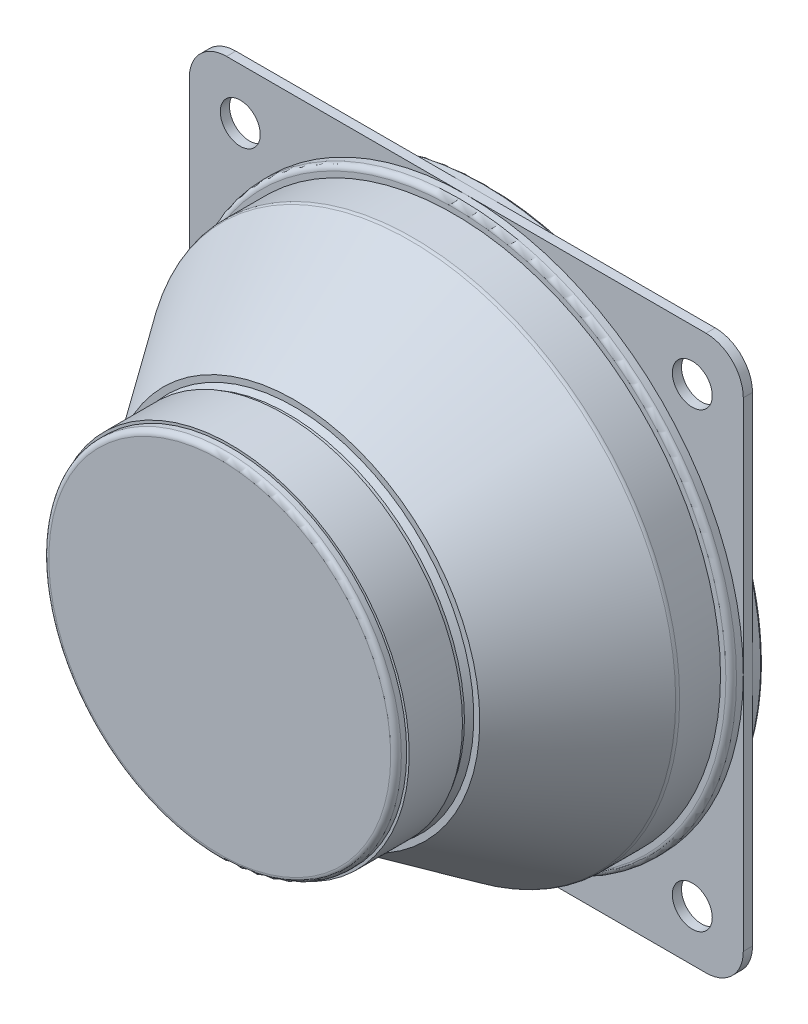
ISO-10303-21;
HEADER;
FILE_DESCRIPTION(('STEP AP214'),'2;1');
FILE_NAME('part.step','',(''),(''),'','','');
FILE_SCHEMA(('AUTOMOTIVE_DESIGN { 1 0 10303 214 1 1 1 1 }'));
ENDSEC;
DATA;
#1=APPLICATION_CONTEXT('core data for automotive mechanical design processes');
#2=APPLICATION_PROTOCOL_DEFINITION('international standard','automotive_design',2000,#1);
#3=PRODUCT_CONTEXT('',#1,'mechanical');
#4=PRODUCT('Part','Part','',(#3));
#5=PRODUCT_RELATED_PRODUCT_CATEGORY('part','',(#4));
#6=PRODUCT_DEFINITION_FORMATION('','',#4);
#7=PRODUCT_DEFINITION_CONTEXT('part definition',#1,'design');
#8=PRODUCT_DEFINITION('design','',#6,#7);
#9=PRODUCT_DEFINITION_SHAPE('','',#8);
#10=(LENGTH_UNIT() NAMED_UNIT(*) SI_UNIT(.MILLI.,.METRE.));
#11=(NAMED_UNIT(*) PLANE_ANGLE_UNIT() SI_UNIT($,.RADIAN.));
#12=(NAMED_UNIT(*) SI_UNIT($,.STERADIAN.) SOLID_ANGLE_UNIT());
#13=UNCERTAINTY_MEASURE_WITH_UNIT(LENGTH_MEASURE(1.E-05),#10,'distance_accuracy_value','');
#14=(GEOMETRIC_REPRESENTATION_CONTEXT(3) GLOBAL_UNCERTAINTY_ASSIGNED_CONTEXT((#13)) GLOBAL_UNIT_ASSIGNED_CONTEXT((#10,
#11,#12)) REPRESENTATION_CONTEXT('',''));
#15=CARTESIAN_POINT('',(0.,0.,0.));
#16=DIRECTION('',(0.,0.,1.));
#17=DIRECTION('',(1.,0.,0.));
#18=AXIS2_PLACEMENT_3D('',#15,#16,#17);
#19=CARTESIAN_POINT('',(-22.5,22.5,0.));
#20=DIRECTION('',(0.,0.,1.));
#21=DIRECTION('',(1.,0.,0.));
#22=AXIS2_PLACEMENT_3D('',#19,#20,#21);
#23=PLANE('',#22);
#24=CARTESIAN_POINT('',(-21.2132034355964,-21.2132034355964,0.));
#25=DIRECTION('',(0.,0.,1.));
#26=DIRECTION('',(-1.,0.,0.));
#27=AXIS2_PLACEMENT_3D('',#24,#25,#26);
#28=CIRCLE('',#27,1.875);
#29=CARTESIAN_POINT('',(-23.0882034355964,-21.2132034355964,0.));
#30=VERTEX_POINT('',#29);
#31=EDGE_CURVE('E195',#30,#30,#28,.T.);
#32=ORIENTED_EDGE('',*,*,#31,.T.);
#33=EDGE_LOOP('',(#32));
#34=FACE_BOUND('',#33,.T.);
#35=DIRECTION('',(0.,-1.,0.));
#36=VECTOR('',#35,1.);
#37=CARTESIAN_POINT('',(-26.,-22.5,0.));
#38=LINE('',#37,#36);
#39=CARTESIAN_POINT('',(-26.,0.,0.));
#40=VERTEX_POINT('',#39);
#41=CARTESIAN_POINT('',(-26.,-22.5,0.));
#42=VERTEX_POINT('',#41);
#43=EDGE_CURVE('E245',#40,#42,#38,.T.);
#44=ORIENTED_EDGE('',*,*,#43,.F.);
#45=CARTESIAN_POINT('',(0.,0.,0.));
#46=DIRECTION('',(0.,0.,-1.));
#47=DIRECTION('',(-1.,0.,0.));
#48=AXIS2_PLACEMENT_3D('',#45,#46,#47);
#49=CIRCLE('',#48,26.);
#50=CARTESIAN_POINT('',(0.,-26.,0.));
#51=VERTEX_POINT('',#50);
#52=EDGE_CURVE('E160',#51,#40,#49,.T.);
#53=ORIENTED_EDGE('',*,*,#52,.F.);
#54=DIRECTION('',(1.,0.,0.));
#55=VECTOR('',#54,1.);
#56=CARTESIAN_POINT('',(22.5,-26.,0.));
#57=LINE('',#56,#55);
#58=CARTESIAN_POINT('',(-22.5,-26.,0.));
#59=VERTEX_POINT('',#58);
#60=EDGE_CURVE('E252',#59,#51,#57,.T.);
#61=ORIENTED_EDGE('',*,*,#60,.F.);
#62=CARTESIAN_POINT('',(-22.5,-22.5,0.));
#63=DIRECTION('',(0.,0.,1.));
#64=DIRECTION('',(-1.,0.,0.));
#65=AXIS2_PLACEMENT_3D('',#62,#63,#64);
#66=CIRCLE('',#65,3.5);
#67=EDGE_CURVE('E249',#42,#59,#66,.T.);
#68=ORIENTED_EDGE('',*,*,#67,.F.);
#69=EDGE_LOOP('',(#44,#53,#61,#68));
#70=FACE_BOUND('',#69,.T.);
#71=ADVANCED_FACE('F38',(#34,#70),#23,.F.);
#72=CARTESIAN_POINT('',(21.2132034355964,-21.2132034355964,0.));
#73=DIRECTION('',(0.,0.,1.));
#74=DIRECTION('',(1.,0.,0.));
#75=AXIS2_PLACEMENT_3D('',#72,#73,#74);
#76=CIRCLE('',#75,1.875);
#77=CARTESIAN_POINT('',(23.0882034355964,-21.2132034355964,0.));
#78=VERTEX_POINT('',#77);
#79=EDGE_CURVE('E191',#78,#78,#76,.T.);
#80=ORIENTED_EDGE('',*,*,#79,.T.);
#81=EDGE_LOOP('',(#80));
#82=FACE_BOUND('',#81,.T.);
#83=CARTESIAN_POINT('',(22.5,-26.,0.));
#84=VERTEX_POINT('',#83);
#85=EDGE_CURVE('E251',#51,#84,#57,.T.);
#86=ORIENTED_EDGE('',*,*,#85,.F.);
#87=CARTESIAN_POINT('',(26.,0.,0.));
#88=VERTEX_POINT('',#87);
#89=EDGE_CURVE('E356',#88,#51,#49,.T.);
#90=ORIENTED_EDGE('',*,*,#89,.F.);
#91=DIRECTION('',(0.,1.,0.));
#92=VECTOR('',#91,1.);
#93=CARTESIAN_POINT('',(26.,-22.5,0.));
#94=LINE('',#93,#92);
#95=CARTESIAN_POINT('',(26.,-22.5,0.));
#96=VERTEX_POINT('',#95);
#97=EDGE_CURVE('E258',#96,#88,#94,.T.);
#98=ORIENTED_EDGE('',*,*,#97,.F.);
#99=CARTESIAN_POINT('',(22.5,-22.5,0.));
#100=DIRECTION('',(0.,0.,1.));
#101=DIRECTION('',(1.,0.,0.));
#102=AXIS2_PLACEMENT_3D('',#99,#100,#101);
#103=CIRCLE('',#102,3.5);
#104=EDGE_CURVE('E255',#84,#96,#103,.T.);
#105=ORIENTED_EDGE('',*,*,#104,.F.);
#106=EDGE_LOOP('',(#86,#90,#98,#105));
#107=FACE_BOUND('',#106,.T.);
#108=ADVANCED_FACE('F315',(#82,#107),#23,.F.);
#109=CARTESIAN_POINT('',(21.2132034355964,21.2132034355964,0.));
#110=DIRECTION('',(0.,0.,1.));
#111=DIRECTION('',(-1.,0.,0.));
#112=AXIS2_PLACEMENT_3D('',#109,#110,#111);
#113=CIRCLE('',#112,1.875);
#114=CARTESIAN_POINT('',(19.3382034355964,21.2132034355964,0.));
#115=VERTEX_POINT('',#114);
#116=EDGE_CURVE('E201',#115,#115,#113,.T.);
#117=ORIENTED_EDGE('',*,*,#116,.T.);
#118=EDGE_LOOP('',(#117));
#119=FACE_BOUND('',#118,.T.);
#120=CARTESIAN_POINT('',(26.,22.5,0.));
#121=VERTEX_POINT('',#120);
#122=EDGE_CURVE('E257',#88,#121,#94,.T.);
#123=ORIENTED_EDGE('',*,*,#122,.F.);
#124=CARTESIAN_POINT('',(0.,26.,0.));
#125=VERTEX_POINT('',#124);
#126=EDGE_CURVE('E354',#125,#88,#49,.T.);
#127=ORIENTED_EDGE('',*,*,#126,.F.);
#128=DIRECTION('',(-1.,0.,0.));
#129=VECTOR('',#128,1.);
#130=CARTESIAN_POINT('',(22.5,26.,0.));
#131=LINE('',#130,#129);
#132=CARTESIAN_POINT('',(22.5,26.,0.));
#133=VERTEX_POINT('',#132);
#134=EDGE_CURVE('E220',#133,#125,#131,.T.);
#135=ORIENTED_EDGE('',*,*,#134,.F.);
#136=CARTESIAN_POINT('',(22.5,22.5,0.));
#137=DIRECTION('',(0.,0.,1.));
#138=DIRECTION('',(1.,0.,0.));
#139=AXIS2_PLACEMENT_3D('',#136,#137,#138);
#140=CIRCLE('',#139,3.5);
#141=EDGE_CURVE('E261',#121,#133,#140,.T.);
#142=ORIENTED_EDGE('',*,*,#141,.F.);
#143=EDGE_LOOP('',(#123,#127,#135,#142));
#144=FACE_BOUND('',#143,.T.);
#145=ADVANCED_FACE('F322',(#119,#144),#23,.F.);
#146=CARTESIAN_POINT('',(-21.2132034355964,21.2132034355964,0.));
#147=DIRECTION('',(0.,0.,1.));
#148=DIRECTION('',(1.,0.,0.));
#149=AXIS2_PLACEMENT_3D('',#146,#147,#148);
#150=CIRCLE('',#149,1.875);
#151=CARTESIAN_POINT('',(-19.3382034355964,21.2132034355964,0.));
#152=VERTEX_POINT('',#151);
#153=EDGE_CURVE('E207',#152,#152,#150,.T.);
#154=ORIENTED_EDGE('',*,*,#153,.T.);
#155=EDGE_LOOP('',(#154));
#156=FACE_BOUND('',#155,.T.);
#157=CARTESIAN_POINT('',(-22.5,26.,0.));
#158=VERTEX_POINT('',#157);
#159=EDGE_CURVE('E263',#125,#158,#131,.T.);
#160=ORIENTED_EDGE('',*,*,#159,.F.);
#161=EDGE_CURVE('E148',#40,#125,#49,.T.);
#162=ORIENTED_EDGE('',*,*,#161,.F.);
#163=CARTESIAN_POINT('',(-26.,22.5,0.));
#164=VERTEX_POINT('',#163);
#165=EDGE_CURVE('E246',#164,#40,#38,.T.);
#166=ORIENTED_EDGE('',*,*,#165,.F.);
#167=CARTESIAN_POINT('',(-22.5,22.5,0.));
#168=DIRECTION('',(0.,0.,1.));
#169=DIRECTION('',(1.,0.,0.));
#170=AXIS2_PLACEMENT_3D('',#167,#168,#169);
#171=CIRCLE('',#170,3.5);
#172=EDGE_CURVE('E213',#158,#164,#171,.T.);
#173=ORIENTED_EDGE('',*,*,#172,.F.);
#174=EDGE_LOOP('',(#160,#162,#166,#173));
#175=FACE_BOUND('',#174,.T.);
#176=ADVANCED_FACE('F318',(#156,#175),#23,.F.);
#177=CARTESIAN_POINT('',(-22.5,22.5,0.8636));
#178=DIRECTION('',(0.,0.,1.));
#179=DIRECTION('',(1.,0.,0.));
#180=AXIS2_PLACEMENT_3D('',#177,#178,#179);
#181=PLANE('',#180);
#182=CARTESIAN_POINT('',(-21.2132034355964,21.2132034355964,0.8636));
#183=DIRECTION('',(0.,0.,1.));
#184=DIRECTION('',(1.,0.,0.));
#185=AXIS2_PLACEMENT_3D('',#182,#183,#184);
#186=CIRCLE('',#185,1.875);
#187=CARTESIAN_POINT('',(-19.3382034355964,21.2132034355964,0.8636));
#188=VERTEX_POINT('',#187);
#189=EDGE_CURVE('E210',#188,#188,#186,.T.);
#190=ORIENTED_EDGE('',*,*,#189,.F.);
#191=EDGE_LOOP('',(#190));
#192=FACE_BOUND('',#191,.T.);
#193=DIRECTION('',(0.,-1.,0.));
#194=VECTOR('',#193,1.);
#195=CARTESIAN_POINT('',(-26.,-22.5,0.8636));
#196=LINE('',#195,#194);
#197=CARTESIAN_POINT('',(-26.,22.5,0.8636));
#198=VERTEX_POINT('',#197);
#199=CARTESIAN_POINT('',(-26.,0.,0.8636));
#200=VERTEX_POINT('',#199);
#201=EDGE_CURVE('E221',#198,#200,#196,.T.);
#202=ORIENTED_EDGE('',*,*,#201,.T.);
#203=CARTESIAN_POINT('',(0.,0.,0.8636));
#204=DIRECTION('',(0.,0.,-1.));
#205=DIRECTION('',(-1.,0.,0.));
#206=AXIS2_PLACEMENT_3D('',#203,#204,#205);
#207=CIRCLE('',#206,26.);
#208=CARTESIAN_POINT('',(0.,26.,0.8636));
#209=VERTEX_POINT('',#208);
#210=EDGE_CURVE('E61',#200,#209,#207,.T.);
#211=ORIENTED_EDGE('',*,*,#210,.T.);
#212=DIRECTION('',(-1.,0.,0.));
#213=VECTOR('',#212,1.);
#214=CARTESIAN_POINT('',(22.5,26.,0.8636));
#215=LINE('',#214,#213);
#216=CARTESIAN_POINT('',(-22.5,26.,0.8636));
#217=VERTEX_POINT('',#216);
#218=EDGE_CURVE('E238',#209,#217,#215,.T.);
#219=ORIENTED_EDGE('',*,*,#218,.T.);
#220=CARTESIAN_POINT('',(-22.5,22.5,0.8636));
#221=DIRECTION('',(0.,0.,1.));
#222=DIRECTION('',(1.,0.,0.));
#223=AXIS2_PLACEMENT_3D('',#220,#221,#222);
#224=CIRCLE('',#223,3.5);
#225=EDGE_CURVE('E216',#217,#198,#224,.T.);
#226=ORIENTED_EDGE('',*,*,#225,.T.);
#227=EDGE_LOOP('',(#202,#211,#219,#226));
#228=FACE_BOUND('',#227,.T.);
#229=ADVANCED_FACE('F328',(#192,#228),#181,.T.);
#230=CARTESIAN_POINT('',(21.2132034355964,21.2132034355964,0.8636));
#231=DIRECTION('',(0.,0.,1.));
#232=DIRECTION('',(-1.,0.,0.));
#233=AXIS2_PLACEMENT_3D('',#230,#231,#232);
#234=CIRCLE('',#233,1.875);
#235=CARTESIAN_POINT('',(19.3382034355964,21.2132034355964,0.8636));
#236=VERTEX_POINT('',#235);
#237=EDGE_CURVE('E204',#236,#236,#234,.T.);
#238=ORIENTED_EDGE('',*,*,#237,.F.);
#239=EDGE_LOOP('',(#238));
#240=FACE_BOUND('',#239,.T.);
#241=CARTESIAN_POINT('',(22.5,26.,0.8636));
#242=VERTEX_POINT('',#241);
#243=EDGE_CURVE('E239',#242,#209,#215,.T.);
#244=ORIENTED_EDGE('',*,*,#243,.T.);
#245=CARTESIAN_POINT('',(26.,0.,0.8636));
#246=VERTEX_POINT('',#245);
#247=EDGE_CURVE('E163',#209,#246,#207,.T.);
#248=ORIENTED_EDGE('',*,*,#247,.T.);
#249=DIRECTION('',(0.,1.,0.));
#250=VECTOR('',#249,1.);
#251=CARTESIAN_POINT('',(26.,-22.5,0.8636));
#252=LINE('',#251,#250);
#253=CARTESIAN_POINT('',(26.,22.5,0.8636));
#254=VERTEX_POINT('',#253);
#255=EDGE_CURVE('E232',#246,#254,#252,.T.);
#256=ORIENTED_EDGE('',*,*,#255,.T.);
#257=CARTESIAN_POINT('',(22.5,22.5,0.8636));
#258=DIRECTION('',(0.,0.,1.));
#259=DIRECTION('',(1.,0.,0.));
#260=AXIS2_PLACEMENT_3D('',#257,#258,#259);
#261=CIRCLE('',#260,3.5);
#262=EDGE_CURVE('E236',#254,#242,#261,.T.);
#263=ORIENTED_EDGE('',*,*,#262,.T.);
#264=EDGE_LOOP('',(#244,#248,#256,#263));
#265=FACE_BOUND('',#264,.T.);
#266=ADVANCED_FACE('F334',(#240,#265),#181,.T.);
#267=CARTESIAN_POINT('',(21.2132034355964,-21.2132034355964,0.8636));
#268=DIRECTION('',(0.,0.,1.));
#269=DIRECTION('',(1.,0.,0.));
#270=AXIS2_PLACEMENT_3D('',#267,#268,#269);
#271=CIRCLE('',#270,1.875);
#272=CARTESIAN_POINT('',(23.0882034355964,-21.2132034355964,0.8636));
#273=VERTEX_POINT('',#272);
#274=EDGE_CURVE('E192',#273,#273,#271,.T.);
#275=ORIENTED_EDGE('',*,*,#274,.F.);
#276=EDGE_LOOP('',(#275));
#277=FACE_BOUND('',#276,.T.);
#278=CARTESIAN_POINT('',(26.,-22.5,0.8636));
#279=VERTEX_POINT('',#278);
#280=EDGE_CURVE('E233',#279,#246,#252,.T.);
#281=ORIENTED_EDGE('',*,*,#280,.T.);
#282=CARTESIAN_POINT('',(0.,-26.,0.8636));
#283=VERTEX_POINT('',#282);
#284=EDGE_CURVE('E401',#246,#283,#207,.T.);
#285=ORIENTED_EDGE('',*,*,#284,.T.);
#286=DIRECTION('',(1.,0.,0.));
#287=VECTOR('',#286,1.);
#288=CARTESIAN_POINT('',(22.5,-26.,0.8636));
#289=LINE('',#288,#287);
#290=CARTESIAN_POINT('',(22.5,-26.,0.8636));
#291=VERTEX_POINT('',#290);
#292=EDGE_CURVE('E226',#283,#291,#289,.T.);
#293=ORIENTED_EDGE('',*,*,#292,.T.);
#294=CARTESIAN_POINT('',(22.5,-22.5,0.8636));
#295=DIRECTION('',(0.,0.,1.));
#296=DIRECTION('',(1.,0.,0.));
#297=AXIS2_PLACEMENT_3D('',#294,#295,#296);
#298=CIRCLE('',#297,3.5);
#299=EDGE_CURVE('E230',#291,#279,#298,.T.);
#300=ORIENTED_EDGE('',*,*,#299,.T.);
#301=EDGE_LOOP('',(#281,#285,#293,#300));
#302=FACE_BOUND('',#301,.T.);
#303=ADVANCED_FACE('F402',(#277,#302),#181,.T.);
#304=CARTESIAN_POINT('',(-21.2132034355964,-21.2132034355964,0.8636));
#305=DIRECTION('',(0.,0.,1.));
#306=DIRECTION('',(-1.,0.,0.));
#307=AXIS2_PLACEMENT_3D('',#304,#305,#306);
#308=CIRCLE('',#307,1.875);
#309=CARTESIAN_POINT('',(-23.0882034355964,-21.2132034355964,0.8636));
#310=VERTEX_POINT('',#309);
#311=EDGE_CURVE('E198',#310,#310,#308,.T.);
#312=ORIENTED_EDGE('',*,*,#311,.F.);
#313=EDGE_LOOP('',(#312));
#314=FACE_BOUND('',#313,.T.);
#315=CARTESIAN_POINT('',(-22.5,-26.,0.8636));
#316=VERTEX_POINT('',#315);
#317=EDGE_CURVE('E227',#316,#283,#289,.T.);
#318=ORIENTED_EDGE('',*,*,#317,.T.);
#319=EDGE_CURVE('E164',#283,#200,#207,.T.);
#320=ORIENTED_EDGE('',*,*,#319,.T.);
#321=CARTESIAN_POINT('',(-26.,-22.5,0.8636));
#322=VERTEX_POINT('',#321);
#323=EDGE_CURVE('E219',#200,#322,#196,.T.);
#324=ORIENTED_EDGE('',*,*,#323,.T.);
#325=CARTESIAN_POINT('',(-22.5,-22.5,0.8636));
#326=DIRECTION('',(0.,0.,1.));
#327=DIRECTION('',(-1.,0.,0.));
#328=AXIS2_PLACEMENT_3D('',#325,#326,#327);
#329=CIRCLE('',#328,3.5);
#330=EDGE_CURVE('E224',#322,#316,#329,.T.);
#331=ORIENTED_EDGE('',*,*,#330,.T.);
#332=EDGE_LOOP('',(#318,#320,#324,#331));
#333=FACE_BOUND('',#332,.T.);
#334=ADVANCED_FACE('F336',(#314,#333),#181,.T.);
#335=CARTESIAN_POINT('',(-22.5,22.5,0.8636));
#336=DIRECTION('',(0.,0.,-1.));
#337=DIRECTION('',(-1.,0.,0.));
#338=AXIS2_PLACEMENT_3D('',#335,#336,#337);
#339=CYLINDRICAL_SURFACE('',#338,3.5);
#340=ORIENTED_EDGE('',*,*,#172,.T.);
#341=DIRECTION('',(0.,0.,-1.));
#342=VECTOR('',#341,1.);
#343=CARTESIAN_POINT('',(-26.,22.5,0.8636));
#344=LINE('',#343,#342);
#345=EDGE_CURVE('E286',#198,#164,#344,.T.);
#346=ORIENTED_EDGE('',*,*,#345,.F.);
#347=ORIENTED_EDGE('',*,*,#225,.F.);
#348=DIRECTION('',(0.,0.,-1.));
#349=VECTOR('',#348,1.);
#350=CARTESIAN_POINT('',(-22.5,26.,0.8636));
#351=LINE('',#350,#349);
#352=EDGE_CURVE('E242',#217,#158,#351,.T.);
#353=ORIENTED_EDGE('',*,*,#352,.T.);
#354=EDGE_LOOP('',(#340,#346,#347,#353));
#355=FACE_BOUND('',#354,.T.);
#356=ADVANCED_FACE('F381',(#355),#339,.T.);
#357=CARTESIAN_POINT('',(-26.,-22.5,0.8636));
#358=DIRECTION('',(1.,0.,0.));
#359=DIRECTION('',(0.,0.,-1.));
#360=AXIS2_PLACEMENT_3D('',#357,#358,#359);
#361=PLANE('',#360);
#362=ORIENTED_EDGE('',*,*,#165,.T.);
#363=ORIENTED_EDGE('',*,*,#43,.T.);
#364=DIRECTION('',(0.,0.,-1.));
#365=VECTOR('',#364,1.);
#366=CARTESIAN_POINT('',(-26.,-22.5,0.8636));
#367=LINE('',#366,#365);
#368=EDGE_CURVE('E283',#322,#42,#367,.T.);
#369=ORIENTED_EDGE('',*,*,#368,.F.);
#370=ORIENTED_EDGE('',*,*,#323,.F.);
#371=ORIENTED_EDGE('',*,*,#201,.F.);
#372=ORIENTED_EDGE('',*,*,#345,.T.);
#373=EDGE_LOOP('',(#362,#363,#369,#370,#371,#372));
#374=FACE_BOUND('',#373,.T.);
#375=ADVANCED_FACE('F377',(#374),#361,.F.);
#376=CARTESIAN_POINT('',(-22.5,-22.5,0.8636));
#377=DIRECTION('',(0.,0.,-1.));
#378=DIRECTION('',(-1.,0.,0.));
#379=AXIS2_PLACEMENT_3D('',#376,#377,#378);
#380=CYLINDRICAL_SURFACE('',#379,3.5);
#381=ORIENTED_EDGE('',*,*,#67,.T.);
#382=DIRECTION('',(0.,0.,-1.));
#383=VECTOR('',#382,1.);
#384=CARTESIAN_POINT('',(-22.5,-26.,0.8636));
#385=LINE('',#384,#383);
#386=EDGE_CURVE('E280',#316,#59,#385,.T.);
#387=ORIENTED_EDGE('',*,*,#386,.F.);
#388=ORIENTED_EDGE('',*,*,#330,.F.);
#389=ORIENTED_EDGE('',*,*,#368,.T.);
#390=EDGE_LOOP('',(#381,#387,#388,#389));
#391=FACE_BOUND('',#390,.T.);
#392=ADVANCED_FACE('F373',(#391),#380,.T.);
#393=CARTESIAN_POINT('',(22.5,-26.,0.8636));
#394=DIRECTION('',(0.,1.,0.));
#395=DIRECTION('',(-1.,0.,0.));
#396=AXIS2_PLACEMENT_3D('',#393,#394,#395);
#397=PLANE('',#396);
#398=ORIENTED_EDGE('',*,*,#60,.T.);
#399=ORIENTED_EDGE('',*,*,#85,.T.);
#400=DIRECTION('',(0.,0.,-1.));
#401=VECTOR('',#400,1.);
#402=CARTESIAN_POINT('',(22.5,-26.,0.8636));
#403=LINE('',#402,#401);
#404=EDGE_CURVE('E277',#291,#84,#403,.T.);
#405=ORIENTED_EDGE('',*,*,#404,.F.);
#406=ORIENTED_EDGE('',*,*,#292,.F.);
#407=ORIENTED_EDGE('',*,*,#317,.F.);
#408=ORIENTED_EDGE('',*,*,#386,.T.);
#409=EDGE_LOOP('',(#398,#399,#405,#406,#407,#408));
#410=FACE_BOUND('',#409,.T.);
#411=ADVANCED_FACE('F367',(#410),#397,.F.);
#412=CARTESIAN_POINT('',(22.5,-22.5,0.8636));
#413=DIRECTION('',(0.,0.,-1.));
#414=DIRECTION('',(-1.,0.,0.));
#415=AXIS2_PLACEMENT_3D('',#412,#413,#414);
#416=CYLINDRICAL_SURFACE('',#415,3.5);
#417=ORIENTED_EDGE('',*,*,#104,.T.);
#418=DIRECTION('',(0.,0.,-1.));
#419=VECTOR('',#418,1.);
#420=CARTESIAN_POINT('',(26.,-22.5,0.8636));
#421=LINE('',#420,#419);
#422=EDGE_CURVE('E274',#279,#96,#421,.T.);
#423=ORIENTED_EDGE('',*,*,#422,.F.);
#424=ORIENTED_EDGE('',*,*,#299,.F.);
#425=ORIENTED_EDGE('',*,*,#404,.T.);
#426=EDGE_LOOP('',(#417,#423,#424,#425));
#427=FACE_BOUND('',#426,.T.);
#428=ADVANCED_FACE('F397',(#427),#416,.T.);
#429=CARTESIAN_POINT('',(26.,-22.5,0.8636));
#430=DIRECTION('',(-1.,0.,0.));
#431=DIRECTION('',(0.,-1.,0.));
#432=AXIS2_PLACEMENT_3D('',#429,#430,#431);
#433=PLANE('',#432);
#434=ORIENTED_EDGE('',*,*,#97,.T.);
#435=ORIENTED_EDGE('',*,*,#122,.T.);
#436=DIRECTION('',(0.,0.,-1.));
#437=VECTOR('',#436,1.);
#438=CARTESIAN_POINT('',(26.,22.5,0.8636));
#439=LINE('',#438,#437);
#440=EDGE_CURVE('E271',#254,#121,#439,.T.);
#441=ORIENTED_EDGE('',*,*,#440,.F.);
#442=ORIENTED_EDGE('',*,*,#255,.F.);
#443=ORIENTED_EDGE('',*,*,#280,.F.);
#444=ORIENTED_EDGE('',*,*,#422,.T.);
#445=EDGE_LOOP('',(#434,#435,#441,#442,#443,#444));
#446=FACE_BOUND('',#445,.T.);
#447=ADVANCED_FACE('F392',(#446),#433,.F.);
#448=CARTESIAN_POINT('',(22.5,22.5,0.8636));
#449=DIRECTION('',(0.,0.,-1.));
#450=DIRECTION('',(-1.,0.,0.));
#451=AXIS2_PLACEMENT_3D('',#448,#449,#450);
#452=CYLINDRICAL_SURFACE('',#451,3.5);
#453=ORIENTED_EDGE('',*,*,#141,.T.);
#454=DIRECTION('',(0.,0.,-1.));
#455=VECTOR('',#454,1.);
#456=CARTESIAN_POINT('',(22.5,26.,0.8636));
#457=LINE('',#456,#455);
#458=EDGE_CURVE('E268',#242,#133,#457,.T.);
#459=ORIENTED_EDGE('',*,*,#458,.F.);
#460=ORIENTED_EDGE('',*,*,#262,.F.);
#461=ORIENTED_EDGE('',*,*,#440,.T.);
#462=EDGE_LOOP('',(#453,#459,#460,#461));
#463=FACE_BOUND('',#462,.T.);
#464=ADVANCED_FACE('F390',(#463),#452,.T.);
#465=CARTESIAN_POINT('',(22.5,26.,0.8636));
#466=DIRECTION('',(0.,-1.,0.));
#467=DIRECTION('',(1.,0.,0.));
#468=AXIS2_PLACEMENT_3D('',#465,#466,#467);
#469=PLANE('',#468);
#470=ORIENTED_EDGE('',*,*,#134,.T.);
#471=ORIENTED_EDGE('',*,*,#159,.T.);
#472=ORIENTED_EDGE('',*,*,#352,.F.);
#473=ORIENTED_EDGE('',*,*,#218,.F.);
#474=ORIENTED_EDGE('',*,*,#243,.F.);
#475=ORIENTED_EDGE('',*,*,#458,.T.);
#476=EDGE_LOOP('',(#470,#471,#472,#473,#474,#475));
#477=FACE_BOUND('',#476,.T.);
#478=ADVANCED_FACE('F347',(#477),#469,.F.);
#479=CARTESIAN_POINT('',(-21.2132034355964,21.2132034355964,0.8636));
#480=DIRECTION('',(0.,0.,-1.));
#481=DIRECTION('',(-1.,0.,0.));
#482=AXIS2_PLACEMENT_3D('',#479,#480,#481);
#483=CYLINDRICAL_SURFACE('',#482,1.875);
#484=ORIENTED_EDGE('',*,*,#189,.T.);
#485=EDGE_LOOP('',(#484));
#486=FACE_BOUND('',#485,.T.);
#487=ORIENTED_EDGE('',*,*,#153,.F.);
#488=EDGE_LOOP('',(#487));
#489=FACE_BOUND('',#488,.T.);
#490=ADVANCED_FACE('F471',(#486,#489),#483,.F.);
#491=CARTESIAN_POINT('',(21.2132034355964,21.2132034355964,0.8636));
#492=DIRECTION('',(0.,0.,-1.));
#493=DIRECTION('',(-1.,0.,0.));
#494=AXIS2_PLACEMENT_3D('',#491,#492,#493);
#495=CYLINDRICAL_SURFACE('',#494,1.875);
#496=ORIENTED_EDGE('',*,*,#237,.T.);
#497=EDGE_LOOP('',(#496));
#498=FACE_BOUND('',#497,.T.);
#499=ORIENTED_EDGE('',*,*,#116,.F.);
#500=EDGE_LOOP('',(#499));
#501=FACE_BOUND('',#500,.T.);
#502=ADVANCED_FACE('F467',(#498,#501),#495,.F.);
#503=CARTESIAN_POINT('',(-21.2132034355964,-21.2132034355964,0.8636));
#504=DIRECTION('',(0.,0.,-1.));
#505=DIRECTION('',(-1.,0.,0.));
#506=AXIS2_PLACEMENT_3D('',#503,#504,#505);
#507=CYLINDRICAL_SURFACE('',#506,1.875);
#508=ORIENTED_EDGE('',*,*,#311,.T.);
#509=EDGE_LOOP('',(#508));
#510=FACE_BOUND('',#509,.T.);
#511=ORIENTED_EDGE('',*,*,#31,.F.);
#512=EDGE_LOOP('',(#511));
#513=FACE_BOUND('',#512,.T.);
#514=ADVANCED_FACE('F463',(#510,#513),#507,.F.);
#515=CARTESIAN_POINT('',(21.2132034355964,-21.2132034355964,0.8636));
#516=DIRECTION('',(0.,0.,-1.));
#517=DIRECTION('',(-1.,0.,0.));
#518=AXIS2_PLACEMENT_3D('',#515,#516,#517);
#519=CYLINDRICAL_SURFACE('',#518,1.875);
#520=ORIENTED_EDGE('',*,*,#274,.T.);
#521=EDGE_LOOP('',(#520));
#522=FACE_BOUND('',#521,.T.);
#523=ORIENTED_EDGE('',*,*,#79,.F.);
#524=EDGE_LOOP('',(#523));
#525=FACE_BOUND('',#524,.T.);
#526=ADVANCED_FACE('F459',(#522,#525),#519,.F.);
#527=CARTESIAN_POINT('',(0.,0.,24.));
#528=DIRECTION('',(0.,0.,1.));
#529=DIRECTION('',(1.,0.,0.));
#530=AXIS2_PLACEMENT_3D('',#527,#528,#529);
#531=PLANE('',#530);
#532=CARTESIAN_POINT('',(0.,0.,24.));
#533=DIRECTION('',(0.,0.,1.));
#534=DIRECTION('',(1.,0.,0.));
#535=AXIS2_PLACEMENT_3D('',#532,#533,#534);
#536=CIRCLE('',#535,16.0454892848238);
#537=CARTESIAN_POINT('',(16.0454892848238,0.,24.));
#538=VERTEX_POINT('',#537);
#539=EDGE_CURVE('E292',#538,#538,#536,.T.);
#540=ORIENTED_EDGE('',*,*,#539,.T.);
#541=EDGE_LOOP('',(#540));
#542=FACE_BOUND('',#541,.T.);
#543=ADVANCED_FACE('F455',(#542),#531,.T.);
#544=CARTESIAN_POINT('',(0.,0.,0.));
#545=DIRECTION('',(0.,0.,-1.));
#546=DIRECTION('',(-1.,0.,0.));
#547=AXIS2_PLACEMENT_3D('',#544,#545,#546);
#548=CYLINDRICAL_SURFACE('',#547,16.5454892848238);
#549=CARTESIAN_POINT('',(0.,0.,23.5));
#550=DIRECTION('',(0.,0.,1.));
#551=DIRECTION('',(1.,0.,0.));
#552=AXIS2_PLACEMENT_3D('',#549,#550,#551);
#553=CIRCLE('',#552,16.5454892848238);
#554=CARTESIAN_POINT('',(16.5454892848238,0.,23.5));
#555=VERTEX_POINT('',#554);
#556=EDGE_CURVE('E289',#555,#555,#553,.F.);
#557=ORIENTED_EDGE('',*,*,#556,.T.);
#558=EDGE_LOOP('',(#557));
#559=FACE_BOUND('',#558,.T.);
#560=CARTESIAN_POINT('',(0.,0.,23.));
#561=DIRECTION('',(0.,0.,-1.));
#562=DIRECTION('',(-1.,0.,0.));
#563=AXIS2_PLACEMENT_3D('',#560,#561,#562);
#564=CIRCLE('',#563,16.5454892848238);
#565=CARTESIAN_POINT('',(-16.5454892848238,0.,23.));
#566=VERTEX_POINT('',#565);
#567=EDGE_CURVE('E188',#566,#566,#564,.T.);
#568=ORIENTED_EDGE('',*,*,#567,.F.);
#569=EDGE_LOOP('',(#568));
#570=FACE_BOUND('',#569,.T.);
#571=ADVANCED_FACE('F451',(#559,#570),#548,.T.);
#572=CARTESIAN_POINT('',(0.,0.,23.));
#573=DIRECTION('',(0.,0.,1.));
#574=DIRECTION('',(1.,0.,0.));
#575=AXIS2_PLACEMENT_3D('',#572,#573,#574);
#576=PLANE('',#575);
#577=ORIENTED_EDGE('',*,*,#567,.T.);
#578=EDGE_LOOP('',(#577));
#579=FACE_BOUND('',#578,.T.);
#580=CARTESIAN_POINT('',(0.,0.,23.));
#581=DIRECTION('',(0.,0.,-1.));
#582=DIRECTION('',(-1.,0.,0.));
#583=AXIS2_PLACEMENT_3D('',#580,#581,#582);
#584=CIRCLE('',#583,16.7813787290145);
#585=CARTESIAN_POINT('',(-16.7813787290145,0.,23.));
#586=VERTEX_POINT('',#585);
#587=EDGE_CURVE('E185',#586,#586,#584,.T.);
#588=ORIENTED_EDGE('',*,*,#587,.F.);
#589=EDGE_LOOP('',(#588));
#590=FACE_BOUND('',#589,.T.);
#591=ADVANCED_FACE('F447',(#579,#590),#576,.T.);
#592=CARTESIAN_POINT('',(0.,0.,0.));
#593=DIRECTION('',(0.,0.,-1.));
#594=DIRECTION('',(-1.,0.,0.));
#595=AXIS2_PLACEMENT_3D('',#592,#593,#594);
#596=CYLINDRICAL_SURFACE('',#595,16.7813787290145);
#597=ORIENTED_EDGE('',*,*,#587,.T.);
#598=EDGE_LOOP('',(#597));
#599=FACE_BOUND('',#598,.T.);
#600=CARTESIAN_POINT('',(0.,0.,18.));
#601=DIRECTION('',(0.,0.,-1.));
#602=DIRECTION('',(-1.,0.,0.));
#603=AXIS2_PLACEMENT_3D('',#600,#601,#602);
#604=CIRCLE('',#603,16.7813787290145);
#605=CARTESIAN_POINT('',(-16.7813787290145,0.,18.));
#606=VERTEX_POINT('',#605);
#607=EDGE_CURVE('E182',#606,#606,#604,.T.);
#608=ORIENTED_EDGE('',*,*,#607,.F.);
#609=EDGE_LOOP('',(#608));
#610=FACE_BOUND('',#609,.T.);
#611=ADVANCED_FACE('F443',(#599,#610),#596,.T.);
#612=CARTESIAN_POINT('',(0.,0.,18.));
#613=DIRECTION('',(0.,0.,-1.));
#614=DIRECTION('',(-1.,0.,0.));
#615=AXIS2_PLACEMENT_3D('',#612,#613,#614);
#616=PLANE('',#615);
#617=ORIENTED_EDGE('',*,*,#607,.T.);
#618=EDGE_LOOP('',(#617));
#619=FACE_BOUND('',#618,.T.);
#620=CARTESIAN_POINT('',(0.,0.,18.));
#621=DIRECTION('',(0.,0.,-1.));
#622=DIRECTION('',(-1.,0.,0.));
#623=AXIS2_PLACEMENT_3D('',#620,#621,#622);
#624=CIRCLE('',#623,16.5480741100496);
#625=CARTESIAN_POINT('',(-16.5480741100496,0.,18.));
#626=VERTEX_POINT('',#625);
#627=EDGE_CURVE('E179',#626,#626,#624,.T.);
#628=ORIENTED_EDGE('',*,*,#627,.F.);
#629=EDGE_LOOP('',(#628));
#630=FACE_BOUND('',#629,.T.);
#631=ADVANCED_FACE('F439',(#619,#630),#616,.T.);
#632=CARTESIAN_POINT('',(0.,0.,0.));
#633=DIRECTION('',(0.,0.,-1.));
#634=DIRECTION('',(-1.,0.,0.));
#635=AXIS2_PLACEMENT_3D('',#632,#633,#634);
#636=CYLINDRICAL_SURFACE('',#635,16.5480741100496);
#637=ORIENTED_EDGE('',*,*,#627,.T.);
#638=EDGE_LOOP('',(#637));
#639=FACE_BOUND('',#638,.T.);
#640=CARTESIAN_POINT('',(0.,0.,17.5849407282303));
#641=DIRECTION('',(0.,0.,-1.));
#642=DIRECTION('',(-1.,0.,0.));
#643=AXIS2_PLACEMENT_3D('',#640,#641,#642);
#644=CIRCLE('',#643,16.5480741100496);
#645=CARTESIAN_POINT('',(-16.5480741100496,0.,17.5849407282303));
#646=VERTEX_POINT('',#645);
#647=EDGE_CURVE('E176',#646,#646,#644,.T.);
#648=ORIENTED_EDGE('',*,*,#647,.F.);
#649=EDGE_LOOP('',(#648));
#650=FACE_BOUND('',#649,.T.);
#651=ADVANCED_FACE('F435',(#639,#650),#636,.T.);
#652=CARTESIAN_POINT('',(0.,0.,17.5849407282303));
#653=DIRECTION('',(0.,0.,-1.));
#654=DIRECTION('',(-1.,0.,0.));
#655=AXIS2_PLACEMENT_3D('',#652,#653,#654);
#656=PLANE('',#655);
#657=ORIENTED_EDGE('',*,*,#647,.T.);
#658=EDGE_LOOP('',(#657));
#659=FACE_BOUND('',#658,.T.);
#660=CARTESIAN_POINT('',(0.,0.,17.5849407282303));
#661=DIRECTION('',(0.,0.,-1.));
#662=DIRECTION('',(-1.,0.,0.));
#663=AXIS2_PLACEMENT_3D('',#660,#661,#662);
#664=CIRCLE('',#663,16.4386005844383);
#665=CARTESIAN_POINT('',(-16.4386005844383,0.,17.5849407282303));
#666=VERTEX_POINT('',#665);
#667=EDGE_CURVE('E173',#666,#666,#664,.T.);
#668=ORIENTED_EDGE('',*,*,#667,.F.);
#669=EDGE_LOOP('',(#668));
#670=FACE_BOUND('',#669,.T.);
#671=ADVANCED_FACE('F431',(#659,#670),#656,.T.);
#672=CARTESIAN_POINT('',(0.,0.,17.));
#673=DIRECTION('',(0.,0.,-1.));
#674=DIRECTION('',(-1.,0.,0.));
#675=AXIS2_PLACEMENT_3D('',#672,#673,#674);
#676=CONICAL_SURFACE('',#675,16.8424045842825,0.604208667404206);
#677=ORIENTED_EDGE('',*,*,#667,.T.);
#678=EDGE_LOOP('',(#677));
#679=FACE_BOUND('',#678,.T.);
#680=CARTESIAN_POINT('',(0.,0.,17.));
#681=DIRECTION('',(0.,0.,-1.));
#682=DIRECTION('',(-1.,0.,0.));
#683=AXIS2_PLACEMENT_3D('',#680,#681,#682);
#684=CIRCLE('',#683,16.8424045842825);
#685=CARTESIAN_POINT('',(-16.8424045842825,0.,17.));
#686=VERTEX_POINT('',#685);
#687=EDGE_CURVE('E170',#686,#686,#684,.T.);
#688=ORIENTED_EDGE('',*,*,#687,.F.);
#689=EDGE_LOOP('',(#688));
#690=FACE_BOUND('',#689,.T.);
#691=ADVANCED_FACE('F427',(#679,#690),#676,.T.);
#692=CARTESIAN_POINT('',(0.,0.,17.));
#693=DIRECTION('',(0.,0.,1.));
#694=DIRECTION('',(1.,0.,0.));
#695=AXIS2_PLACEMENT_3D('',#692,#693,#694);
#696=PLANE('',#695);
#697=ORIENTED_EDGE('',*,*,#687,.T.);
#698=EDGE_LOOP('',(#697));
#699=FACE_BOUND('',#698,.T.);
#700=CARTESIAN_POINT('',(0.,0.,17.));
#701=DIRECTION('',(0.,0.,-1.));
#702=DIRECTION('',(-1.,0.,0.));
#703=AXIS2_PLACEMENT_3D('',#700,#701,#702);
#704=CIRCLE('',#703,17.4019250439422);
#705=CARTESIAN_POINT('',(-17.4019250439422,0.,17.));
#706=VERTEX_POINT('',#705);
#707=EDGE_CURVE('E167',#706,#706,#704,.T.);
#708=ORIENTED_EDGE('',*,*,#707,.F.);
#709=EDGE_LOOP('',(#708));
#710=FACE_BOUND('',#709,.T.);
#711=ADVANCED_FACE('F423',(#699,#710),#696,.T.);
#712=CARTESIAN_POINT('',(0.,0.,5.9936120007254));
#713=DIRECTION('',(0.,0.,-1.));
#714=DIRECTION('',(-1.,0.,0.));
#715=AXIS2_PLACEMENT_3D('',#712,#713,#714);
#716=CONICAL_SURFACE('',#715,25.,0.604208667404213);
#717=CARTESIAN_POINT('',(0.,0.,6.12184578849249));
#718=DIRECTION('',(0.,0.,1.));
#719=DIRECTION('',(1.,0.,0.));
#720=AXIS2_PLACEMENT_3D('',#717,#718,#719);
#721=CIRCLE('',#720,24.9114759600136);
#722=CARTESIAN_POINT('',(24.9114759600136,0.,6.12184578849249));
#723=VERTEX_POINT('',#722);
#724=EDGE_CURVE('E298',#723,#723,#721,.T.);
#725=ORIENTED_EDGE('',*,*,#724,.T.);
#726=EDGE_LOOP('',(#725));
#727=FACE_BOUND('',#726,.T.);
#728=ORIENTED_EDGE('',*,*,#707,.T.);
#729=EDGE_LOOP('',(#728));
#730=FACE_BOUND('',#729,.T.);
#731=ADVANCED_FACE('F419',(#727,#730),#716,.T.);
#732=CARTESIAN_POINT('',(0.,0.,0.));
#733=DIRECTION('',(0.,0.,-1.));
#734=DIRECTION('',(-1.,0.,0.));
#735=AXIS2_PLACEMENT_3D('',#732,#733,#734);
#736=CYLINDRICAL_SURFACE('',#735,25.);
#737=CARTESIAN_POINT('',(0.,0.,5.83779027572979));
#738=DIRECTION('',(0.,0.,1.));
#739=DIRECTION('',(1.,0.,0.));
#740=AXIS2_PLACEMENT_3D('',#737,#738,#739);
#741=CIRCLE('',#740,25.);
#742=CARTESIAN_POINT('',(25.,0.,5.83779027572979));
#743=VERTEX_POINT('',#742);
#744=EDGE_CURVE('E295',#743,#743,#741,.F.);
#745=ORIENTED_EDGE('',*,*,#744,.T.);
#746=EDGE_LOOP('',(#745));
#747=FACE_BOUND('',#746,.T.);
#748=CARTESIAN_POINT('',(0.,0.,2.));
#749=DIRECTION('',(0.,0.,-1.));
#750=DIRECTION('',(-1.,0.,0.));
#751=AXIS2_PLACEMENT_3D('',#748,#749,#750);
#752=CIRCLE('',#751,25.);
#753=CARTESIAN_POINT('',(-25.,0.,2.));
#754=VERTEX_POINT('',#753);
#755=EDGE_CURVE('E162',#754,#754,#752,.T.);
#756=ORIENTED_EDGE('',*,*,#755,.F.);
#757=EDGE_LOOP('',(#756));
#758=FACE_BOUND('',#757,.T.);
#759=ADVANCED_FACE('F412',(#747,#758),#736,.T.);
#760=CARTESIAN_POINT('',(0.,0.,2.));
#761=DIRECTION('',(0.,0.,1.));
#762=DIRECTION('',(1.,0.,0.));
#763=AXIS2_PLACEMENT_3D('',#760,#761,#762);
#764=PLANE('',#763);
#765=CARTESIAN_POINT('',(0.,0.,2.));
#766=DIRECTION('',(0.,0.,1.));
#767=DIRECTION('',(1.,0.,0.));
#768=AXIS2_PLACEMENT_3D('',#765,#766,#767);
#769=CIRCLE('',#768,25.5);
#770=CARTESIAN_POINT('',(25.5,0.,2.));
#771=VERTEX_POINT('',#770);
#772=EDGE_CURVE('E11',#771,#771,#769,.T.);
#773=ORIENTED_EDGE('',*,*,#772,.T.);
#774=EDGE_LOOP('',(#773));
#775=FACE_BOUND('',#774,.T.);
#776=ORIENTED_EDGE('',*,*,#755,.T.);
#777=EDGE_LOOP('',(#776));
#778=FACE_BOUND('',#777,.T.);
#779=ADVANCED_FACE('F404',(#775,#778),#764,.T.);
#780=CARTESIAN_POINT('',(0.,0.,0.));
#781=DIRECTION('',(0.,0.,-1.));
#782=DIRECTION('',(-1.,0.,0.));
#783=AXIS2_PLACEMENT_3D('',#780,#781,#782);
#784=CYLINDRICAL_SURFACE('',#783,26.);
#785=CARTESIAN_POINT('',(0.,0.,1.5));
#786=DIRECTION('',(0.,0.,1.));
#787=DIRECTION('',(1.,0.,0.));
#788=AXIS2_PLACEMENT_3D('',#785,#786,#787);
#789=CIRCLE('',#788,26.);
#790=CARTESIAN_POINT('',(26.,0.,1.5));
#791=VERTEX_POINT('',#790);
#792=EDGE_CURVE('E46',#791,#791,#789,.F.);
#793=ORIENTED_EDGE('',*,*,#792,.T.);
#794=EDGE_LOOP('',(#793));
#795=FACE_BOUND('',#794,.T.);
#796=ORIENTED_EDGE('',*,*,#210,.F.);
#797=ORIENTED_EDGE('',*,*,#319,.F.);
#798=ORIENTED_EDGE('',*,*,#284,.F.);
#799=ORIENTED_EDGE('',*,*,#247,.F.);
#800=EDGE_LOOP('',(#796,#797,#798,#799));
#801=FACE_BOUND('',#800,.T.);
#802=ADVANCED_FACE('F303',(#795,#801),#784,.T.);
#803=CARTESIAN_POINT('',(0.,0.,0.));
#804=DIRECTION('',(0.,0.,-1.));
#805=DIRECTION('',(-1.,0.,0.));
#806=AXIS2_PLACEMENT_3D('',#803,#804,#805);
#807=CYLINDRICAL_SURFACE('',#806,26.);
#808=DIRECTION('',(0.,0.,1.));
#809=VECTOR('',#808,1.);
#810=CARTESIAN_POINT('',(-26.,0.,0.));
#811=LINE('',#810,#809);
#812=CARTESIAN_POINT('',(-26.,0.,-0.773275175068739));
#813=VERTEX_POINT('',#812);
#814=EDGE_CURVE('E53',#813,#40,#811,.T.);
#815=ORIENTED_EDGE('',*,*,#814,.F.);
#816=CARTESIAN_POINT('',(0.,0.,-0.773275175068739));
#817=DIRECTION('',(0.,0.,-1.));
#818=DIRECTION('',(-1.,0.,0.));
#819=AXIS2_PLACEMENT_3D('',#816,#817,#818);
#820=CIRCLE('',#819,26.);
#821=EDGE_CURVE('E145',#813,#813,#820,.T.);
#822=ORIENTED_EDGE('',*,*,#821,.F.);
#823=ORIENTED_EDGE('',*,*,#814,.T.);
#824=ORIENTED_EDGE('',*,*,#161,.T.);
#825=ORIENTED_EDGE('',*,*,#126,.T.);
#826=ORIENTED_EDGE('',*,*,#89,.T.);
#827=ORIENTED_EDGE('',*,*,#52,.T.);
#828=EDGE_LOOP('',(#815,#822,#823,#824,#825,#826,#827));
#829=FACE_BOUND('',#828,.T.);
#830=ADVANCED_FACE('F358',(#829),#807,.T.);
#831=CARTESIAN_POINT('',(0.,0.,-0.773275175068739));
#832=DIRECTION('',(0.,0.,-1.));
#833=DIRECTION('',(-1.,0.,0.));
#834=AXIS2_PLACEMENT_3D('',#831,#832,#833);
#835=TOROIDAL_SURFACE('',#834,25.85,0.15);
#836=CARTESIAN_POINT('',(-25.85,0.,-0.773275175068739));
#837=DIRECTION('',(0.,1.,0.));
#838=DIRECTION('',(0.,0.,-1.));
#839=AXIS2_PLACEMENT_3D('',#836,#837,#838);
#840=CIRCLE('',#839,0.15);
#841=CARTESIAN_POINT('',(-25.85,0.,-0.923275175068739));
#842=VERTEX_POINT('',#841);
#843=EDGE_CURVE('E153',#842,#813,#840,.T.);
#844=ORIENTED_EDGE('',*,*,#843,.F.);
#845=CARTESIAN_POINT('',(0.,0.,-0.923275175068739));
#846=DIRECTION('',(0.,0.,-1.));
#847=DIRECTION('',(-1.,0.,0.));
#848=AXIS2_PLACEMENT_3D('',#845,#846,#847);
#849=CIRCLE('',#848,25.85);
#850=EDGE_CURVE('E142',#842,#842,#849,.T.);
#851=ORIENTED_EDGE('',*,*,#850,.F.);
#852=ORIENTED_EDGE('',*,*,#843,.T.);
#853=ORIENTED_EDGE('',*,*,#821,.T.);
#854=EDGE_LOOP('',(#844,#851,#852,#853));
#855=FACE_BOUND('',#854,.T.);
#856=ADVANCED_FACE('F410',(#855),#835,.T.);
#857=CARTESIAN_POINT('',(-25.85,0.,-0.923275175068738));
#858=DIRECTION('',(0.,0.,-1.));
#859=DIRECTION('',(-1.,0.,0.));
#860=AXIS2_PLACEMENT_3D('',#857,#858,#859);
#861=PLANE('',#860);
#862=ORIENTED_EDGE('',*,*,#850,.T.);
#863=EDGE_LOOP('',(#862));
#864=FACE_BOUND('',#863,.T.);
#865=CARTESIAN_POINT('',(0.,0.,-0.923275175068738));
#866=DIRECTION('',(0.,0.,-1.));
#867=DIRECTION('',(-1.,0.,0.));
#868=AXIS2_PLACEMENT_3D('',#865,#866,#867);
#869=CIRCLE('',#868,24.8965931313592);
#870=CARTESIAN_POINT('',(-24.8965931313592,0.,-0.923275175068738));
#871=VERTEX_POINT('',#870);
#872=EDGE_CURVE('E136',#871,#871,#869,.T.);
#873=ORIENTED_EDGE('',*,*,#872,.F.);
#874=EDGE_LOOP('',(#873));
#875=FACE_BOUND('',#874,.T.);
#876=ADVANCED_FACE('F612',(#864,#875),#861,.T.);
#877=CARTESIAN_POINT('',(0.,0.,0.));
#878=DIRECTION('',(0.,0.,-1.));
#879=DIRECTION('',(-1.,0.,0.));
#880=AXIS2_PLACEMENT_3D('',#877,#878,#879);
#881=CYLINDRICAL_SURFACE('',#880,24.8965931313592);
#882=ORIENTED_EDGE('',*,*,#872,.T.);
#883=EDGE_LOOP('',(#882));
#884=FACE_BOUND('',#883,.T.);
#885=CARTESIAN_POINT('',(0.,0.,0.));
#886=DIRECTION('',(0.,0.,-1.));
#887=DIRECTION('',(-1.,0.,0.));
#888=AXIS2_PLACEMENT_3D('',#885,#886,#887);
#889=CIRCLE('',#888,24.8965931313592);
#890=CARTESIAN_POINT('',(-24.8965931313592,0.,0.));
#891=VERTEX_POINT('',#890);
#892=EDGE_CURVE('E143',#891,#891,#889,.T.);
#893=ORIENTED_EDGE('',*,*,#892,.F.);
#894=EDGE_LOOP('',(#893));
#895=FACE_BOUND('',#894,.T.);
#896=ADVANCED_FACE('F137',(#884,#895),#881,.F.);
#897=CARTESIAN_POINT('',(0.,0.,-48.9998143668894));
#898=DIRECTION('',(0.,0.,-1.));
#899=DIRECTION('',(-1.,0.,0.));
#900=AXIS2_PLACEMENT_3D('',#897,#898,#899);
#901=SPHERICAL_SURFACE('',#900,54.9934263676148);
#902=CARTESIAN_POINT('',(0.,0.,2.24596113107406));
#903=DIRECTION('',(0.,0.,-1.));
#904=DIRECTION('',(-1.,0.,0.));
#905=AXIS2_PLACEMENT_3D('',#902,#903,#904);
#906=CIRCLE('',#905,19.9536321822018);
#907=CARTESIAN_POINT('',(-19.9536321822018,0.,2.24596113107406));
#908=VERTEX_POINT('',#907);
#909=EDGE_CURVE('E154',#908,#908,#906,.T.);
#910=ORIENTED_EDGE('',*,*,#909,.T.);
#911=EDGE_LOOP('',(#910));
#912=FACE_BOUND('',#911,.T.);
#913=ADVANCED_FACE('F631',(#912),#901,.F.);
#914=CARTESIAN_POINT('',(0.,0.,2.74637677414316));
#915=DIRECTION('',(0.,0.,-1.));
#916=DIRECTION('',(-1.,0.,0.));
#917=AXIS2_PLACEMENT_3D('',#914,#915,#916);
#918=TOROIDAL_SURFACE('',#917,23.1627443763845,3.24789422405969);
#919=ORIENTED_EDGE('',*,*,#909,.F.);
#920=EDGE_LOOP('',(#919));
#921=FACE_BOUND('',#920,.T.);
#922=ORIENTED_EDGE('',*,*,#892,.T.);
#923=EDGE_LOOP('',(#922));
#924=FACE_BOUND('',#923,.T.);
#925=ADVANCED_FACE('F643',(#921,#924),#918,.T.);
#926=CARTESIAN_POINT('',(0.,0.,23.5));
#927=DIRECTION('',(0.,0.,1.));
#928=DIRECTION('',(1.,0.,0.));
#929=AXIS2_PLACEMENT_3D('',#926,#927,#928);
#930=TOROIDAL_SURFACE('',#929,16.0454892848238,0.5);
#931=ORIENTED_EDGE('',*,*,#539,.F.);
#932=EDGE_LOOP('',(#931));
#933=FACE_BOUND('',#932,.T.);
#934=ORIENTED_EDGE('',*,*,#556,.F.);
#935=EDGE_LOOP('',(#934));
#936=FACE_BOUND('',#935,.T.);
#937=ADVANCED_FACE('F311',(#933,#936),#930,.T.);
#938=CARTESIAN_POINT('',(0.,0.,5.83779027572979));
#939=DIRECTION('',(0.,0.,1.));
#940=DIRECTION('',(1.,0.,0.));
#941=AXIS2_PLACEMENT_3D('',#938,#939,#940);
#942=TOROIDAL_SURFACE('',#941,24.5,0.5);
#943=ORIENTED_EDGE('',*,*,#724,.F.);
#944=EDGE_LOOP('',(#943));
#945=FACE_BOUND('',#944,.T.);
#946=ORIENTED_EDGE('',*,*,#744,.F.);
#947=EDGE_LOOP('',(#946));
#948=FACE_BOUND('',#947,.T.);
#949=ADVANCED_FACE('F306',(#945,#948),#942,.T.);
#950=CARTESIAN_POINT('',(0.,0.,1.5));
#951=DIRECTION('',(0.,0.,1.));
#952=DIRECTION('',(1.,0.,0.));
#953=AXIS2_PLACEMENT_3D('',#950,#951,#952);
#954=TOROIDAL_SURFACE('',#953,25.5,0.5);
#955=ORIENTED_EDGE('',*,*,#772,.F.);
#956=EDGE_LOOP('',(#955));
#957=FACE_BOUND('',#956,.T.);
#958=ORIENTED_EDGE('',*,*,#792,.F.);
#959=EDGE_LOOP('',(#958));
#960=FACE_BOUND('',#959,.T.);
#961=ADVANCED_FACE('F40',(#957,#960),#954,.T.);
#962=CLOSED_SHELL('',(#71,#108,#145,#176,#229,#266,#303,#334,#356,#375,#392,#411,#428,#447,#464,
#478,#490,#502,#514,#526,#543,#571,#591,#611,#631,#651,#671,#691,#711,#731,#759,#779,#802,#830,
#856,#876,#896,#913,#925,#937,#949,#961));
#963=MANIFOLD_SOLID_BREP('B2',#962);
#964=ADVANCED_BREP_SHAPE_REPRESENTATION('',(#18,#963),#14);
#965=SHAPE_DEFINITION_REPRESENTATION(#9,#964);
ENDSEC;
END-ISO-10303-21;
